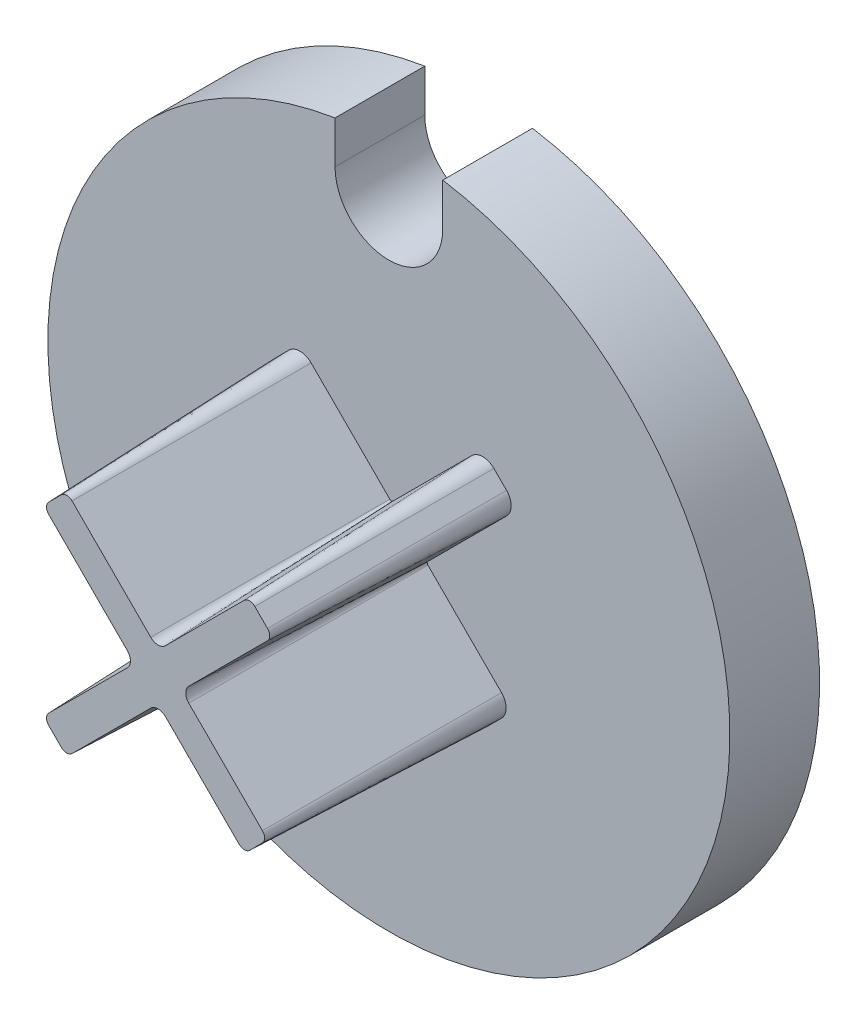
ISO-10303-21;
HEADER;
FILE_DESCRIPTION(('STEP AP214'),'2;1');
FILE_NAME('part.step','',(''),(''),'','','');
FILE_SCHEMA(('AUTOMOTIVE_DESIGN { 1 0 10303 214 1 1 1 1 }'));
ENDSEC;
DATA;
#1=APPLICATION_CONTEXT('core data for automotive mechanical design processes');
#2=APPLICATION_PROTOCOL_DEFINITION('international standard','automotive_design',2000,#1);
#3=PRODUCT_CONTEXT('',#1,'mechanical');
#4=PRODUCT('Part','Part','',(#3));
#5=PRODUCT_RELATED_PRODUCT_CATEGORY('part','',(#4));
#6=PRODUCT_DEFINITION_FORMATION('','',#4);
#7=PRODUCT_DEFINITION_CONTEXT('part definition',#1,'design');
#8=PRODUCT_DEFINITION('design','',#6,#7);
#9=PRODUCT_DEFINITION_SHAPE('','',#8);
#10=(LENGTH_UNIT() NAMED_UNIT(*) SI_UNIT(.MILLI.,.METRE.));
#11=(NAMED_UNIT(*) PLANE_ANGLE_UNIT() SI_UNIT($,.RADIAN.));
#12=(NAMED_UNIT(*) SI_UNIT($,.STERADIAN.) SOLID_ANGLE_UNIT());
#13=UNCERTAINTY_MEASURE_WITH_UNIT(LENGTH_MEASURE(1.E-05),#10,'distance_accuracy_value','');
#14=(GEOMETRIC_REPRESENTATION_CONTEXT(3) GLOBAL_UNCERTAINTY_ASSIGNED_CONTEXT((#13)) GLOBAL_UNIT_ASSIGNED_CONTEXT((#10,
#11,#12)) REPRESENTATION_CONTEXT('',''));
#15=CARTESIAN_POINT('',(0.,0.,0.));
#16=DIRECTION('',(0.,0.,1.));
#17=DIRECTION('',(1.,0.,0.));
#18=AXIS2_PLACEMENT_3D('',#15,#16,#17);
#19=CARTESIAN_POINT('',(-2.82993498988716,2.7703507497106,9.));
#20=DIRECTION('',(-0.706676030840835,0.706676030840835,0.0348994967025009));
#21=DIRECTION('',(-0.707106781186547,-0.707106781186547,0.));
#22=AXIS2_PLACEMENT_3D('',#19,#20,#21);
#23=PLANE('',#22);
#24=DIRECTION('',(0.0246776707783356,-0.0246776707783364,0.999390827019096));
#25=VECTOR('',#24,1.);
#26=CARTESIAN_POINT('',(-12324.5093436122,12324.8628970032,-499000.));
#27=LINE('',#26,#25);
#28=CARTESIAN_POINT('',(-2.78386880842862,3.13742219902068,2.50000000004093));
#29=VERTEX_POINT('',#28);
#30=CARTESIAN_POINT('',(-2.62336617450193,2.97691956509335,9.00000000003934));
#31=VERTEX_POINT('',#30);
#32=EDGE_CURVE('E204',#29,#31,#27,.T.);
#33=ORIENTED_EDGE('',*,*,#32,.F.);
#34=DIRECTION('',(-0.707106781186547,-0.707106781186547,0.));
#35=VECTOR('',#34,1.);
#36=CARTESIAN_POINT('',(-2.9904376238143,2.93085338363774,2.5));
#37=LINE('',#36,#35);
#38=CARTESIAN_POINT('',(-3.13742219902176,2.78386880842914,2.50000000004093));
#39=VERTEX_POINT('',#38);
#40=EDGE_CURVE('E199',#29,#39,#37,.T.);
#41=ORIENTED_EDGE('',*,*,#40,.T.);
#42=DIRECTION('',(0.024677670778336,-0.024677670778336,0.999390827019096));
#43=VECTOR('',#42,1.);
#44=CARTESIAN_POINT('',(-12324.862897003,12324.5093436124,-499000.));
#45=LINE('',#44,#43);
#46=CARTESIAN_POINT('',(-2.97691956509417,2.62336617450155,9.00000000003934));
#47=VERTEX_POINT('',#46);
#48=EDGE_CURVE('E201',#47,#39,#45,.F.);
#49=ORIENTED_EDGE('',*,*,#48,.F.);
#50=DIRECTION('',(-0.707106781186547,-0.707106781186547,0.));
#51=VECTOR('',#50,1.);
#52=CARTESIAN_POINT('',(-2.82993498988716,2.7703507497106,9.));
#53=LINE('',#52,#51);
#54=EDGE_CURVE('E209',#47,#31,#53,.F.);
#55=ORIENTED_EDGE('',*,*,#54,.T.);
#56=EDGE_LOOP('',(#33,#41,#49,#55));
#57=FACE_BOUND('',#56,.T.);
#58=ADVANCED_FACE('F17',(#57),#23,.T.);
#59=CARTESIAN_POINT('',(2.90064566800582,2.84106142782925,9.));
#60=DIRECTION('',(0.706676030840834,0.706676030840835,0.0348994967025009));
#61=DIRECTION('',(-0.707106781186548,0.707106781186547,0.));
#62=AXIS2_PLACEMENT_3D('',#59,#60,#61);
#63=PLANE('',#62);
#64=DIRECTION('',(-0.0246776707783364,-0.0246776707783356,0.999390827019096));
#65=VECTOR('',#64,1.);
#66=CARTESIAN_POINT('',(12325.0043183594,12324.5093436122,-499000.));
#67=LINE('',#66,#65);
#68=CARTESIAN_POINT('',(3.27884355526031,2.78386880842853,2.50000000004093));
#69=VERTEX_POINT('',#68);
#70=CARTESIAN_POINT('',(3.11834092133272,2.62336617450094,9.00000000003934));
#71=VERTEX_POINT('',#70);
#72=EDGE_CURVE('E235',#69,#71,#67,.T.);
#73=ORIENTED_EDGE('',*,*,#72,.F.);
#74=DIRECTION('',(-0.707106781186548,0.707106781186547,0.));
#75=VECTOR('',#74,1.);
#76=CARTESIAN_POINT('',(3.06114830193296,3.00156406175639,2.5));
#77=LINE('',#76,#75);
#78=CARTESIAN_POINT('',(2.92529016466504,3.13742219902203,2.50000000004093));
#79=VERTEX_POINT('',#78);
#80=EDGE_CURVE('E264',#69,#79,#77,.T.);
#81=ORIENTED_EDGE('',*,*,#80,.T.);
#82=DIRECTION('',(-0.024677670778336,-0.024677670778336,0.999390827019096));
#83=VECTOR('',#82,1.);
#84=CARTESIAN_POINT('',(12324.6507649686,12324.862897003,-499000.));
#85=LINE('',#84,#83);
#86=CARTESIAN_POINT('',(2.76478753073833,2.97691956509444,9.00000000003934));
#87=VERTEX_POINT('',#86);
#88=EDGE_CURVE('E231',#87,#79,#85,.F.);
#89=ORIENTED_EDGE('',*,*,#88,.F.);
#90=DIRECTION('',(-0.707106781186548,0.707106781186547,0.));
#91=VECTOR('',#90,1.);
#92=CARTESIAN_POINT('',(2.90064566800582,2.84106142782925,9.));
#93=LINE('',#92,#91);
#94=EDGE_CURVE('E208',#87,#71,#93,.F.);
#95=ORIENTED_EDGE('',*,*,#94,.T.);
#96=EDGE_LOOP('',(#73,#81,#89,#95));
#97=FACE_BOUND('',#96,.T.);
#98=ADVANCED_FACE('F574',(#97),#63,.T.);
#99=CARTESIAN_POINT('',(2.7703507497106,-2.82993498988716,9.));
#100=DIRECTION('',(0.706676030840835,-0.706676030840834,0.0348994967025009));
#101=DIRECTION('',(0.707106781186547,0.707106781186548,0.));
#102=AXIS2_PLACEMENT_3D('',#99,#100,#101);
#103=PLANE('',#102);
#104=DIRECTION('',(-0.024677670778336,0.024677670778336,0.999390827019096));
#105=VECTOR('',#104,1.);
#106=CARTESIAN_POINT('',(12324.5093436124,-12324.862897003,-499000.));
#107=LINE('',#106,#105);
#108=CARTESIAN_POINT('',(2.783868808427,-3.13742219902185,2.50000000004093));
#109=VERTEX_POINT('',#108);
#110=CARTESIAN_POINT('',(2.62336617449999,-2.97691956509484,9.00000000003934));
#111=VERTEX_POINT('',#110);
#112=EDGE_CURVE('E243',#109,#111,#107,.T.);
#113=ORIENTED_EDGE('',*,*,#112,.F.);
#114=DIRECTION('',(0.707106781186547,0.707106781186548,0.));
#115=VECTOR('',#114,1.);
#116=CARTESIAN_POINT('',(2.93085338363774,-2.9904376238143,2.5));
#117=LINE('',#116,#115);
#118=CARTESIAN_POINT('',(3.13742219902096,-2.78386880842745,2.50000000004093));
#119=VERTEX_POINT('',#118);
#120=EDGE_CURVE('E260',#109,#119,#117,.T.);
#121=ORIENTED_EDGE('',*,*,#120,.T.);
#122=DIRECTION('',(-0.024677670778336,0.024677670778336,0.999390827019096));
#123=VECTOR('',#122,1.);
#124=CARTESIAN_POINT('',(12324.862897003,-12324.5093436124,-499000.));
#125=LINE('',#124,#123);
#126=CARTESIAN_POINT('',(2.97691956509426,-2.62336617450013,9.00000000003934));
#127=VERTEX_POINT('',#126);
#128=EDGE_CURVE('E239',#127,#119,#125,.F.);
#129=ORIENTED_EDGE('',*,*,#128,.F.);
#130=DIRECTION('',(0.707106781186547,0.707106781186548,0.));
#131=VECTOR('',#130,1.);
#132=CARTESIAN_POINT('',(2.7703507497106,-2.82993498988716,9.));
#133=LINE('',#132,#131);
#134=EDGE_CURVE('E262',#127,#111,#133,.F.);
#135=ORIENTED_EDGE('',*,*,#134,.T.);
#136=EDGE_LOOP('',(#113,#121,#129,#135));
#137=FACE_BOUND('',#136,.T.);
#138=ADVANCED_FACE('F571',(#137),#103,.T.);
#139=CARTESIAN_POINT('',(-2.84106142782925,-2.90064566800582,9.));
#140=DIRECTION('',(-0.706676030840835,-0.706676030840835,0.0348994967025009));
#141=DIRECTION('',(0.707106781186547,-0.707106781186547,0.));
#142=AXIS2_PLACEMENT_3D('',#139,#140,#141);
#143=PLANE('',#142);
#144=DIRECTION('',(0.024677670778336,0.024677670778336,0.999390827019096));
#145=VECTOR('',#144,1.);
#146=CARTESIAN_POINT('',(-12324.862897003,-12324.6507649687,-499000.));
#147=LINE('',#146,#145);
#148=CARTESIAN_POINT('',(-3.13742219902203,-2.92529016466699,2.50000000001251));
#149=VERTEX_POINT('',#148);
#150=CARTESIAN_POINT('',(-2.97691956509502,-2.76478753073998,9.00000000001091));
#151=VERTEX_POINT('',#150);
#152=EDGE_CURVE('E252',#149,#151,#147,.T.);
#153=ORIENTED_EDGE('',*,*,#152,.F.);
#154=DIRECTION('',(0.707106781186547,-0.707106781186547,0.));
#155=VECTOR('',#154,1.);
#156=CARTESIAN_POINT('',(-3.00156406175639,-3.06114830193296,2.5));
#157=LINE('',#156,#155);
#158=CARTESIAN_POINT('',(-2.78386880842807,-3.27884355525828,2.50000000004093));
#159=VERTEX_POINT('',#158);
#160=EDGE_CURVE('E217',#149,#159,#157,.T.);
#161=ORIENTED_EDGE('',*,*,#160,.T.);
#162=DIRECTION('',(0.0246776707783352,0.0246776707783368,0.999390827019096));
#163=VECTOR('',#162,1.);
#164=CARTESIAN_POINT('',(-12324.509343612,-12325.0043183596,-499000.));
#165=LINE('',#164,#163);
#166=CARTESIAN_POINT('',(-2.62336617450106,-3.11834092133127,9.00000000003934));
#167=VERTEX_POINT('',#166);
#168=EDGE_CURVE('E248',#167,#159,#165,.F.);
#169=ORIENTED_EDGE('',*,*,#168,.F.);
#170=DIRECTION('',(0.707106781186547,-0.707106781186547,0.));
#171=VECTOR('',#170,1.);
#172=CARTESIAN_POINT('',(-2.84106142782925,-2.90064566800582,9.));
#173=LINE('',#172,#171);
#174=EDGE_CURVE('E258',#167,#151,#173,.F.);
#175=ORIENTED_EDGE('',*,*,#174,.T.);
#176=EDGE_LOOP('',(#153,#161,#169,#175));
#177=FACE_BOUND('',#176,.T.);
#178=ADVANCED_FACE('F568',(#177),#143,.T.);
#179=CARTESIAN_POINT('',(-2.82842712474619,2.47487373415291,2.50000000016826));
#180=DIRECTION('',(0.,0.,-1.));
#181=DIRECTION('',(-1.,0.,0.));
#182=AXIS2_PLACEMENT_3D('',#179,#180,#181);
#183=CONICAL_SURFACE('',#182,0.436985024740443,0.0349065850394729);
#184=ORIENTED_EDGE('',*,*,#48,.T.);
#185=CARTESIAN_POINT('',(-2.82842712474619,2.47487373415291,2.49999999999773));
#186=DIRECTION('',(0.,0.,-1.));
#187=DIRECTION('',(-1.,0.,0.));
#188=AXIS2_PLACEMENT_3D('',#185,#186,#187);
#189=CIRCLE('',#188,0.436985024746398);
#190=CARTESIAN_POINT('',(-3.13742219902268,2.16587865987643,2.49999999999886));
#191=VERTEX_POINT('',#190);
#192=EDGE_CURVE('E20',#39,#191,#189,.F.);
#193=ORIENTED_EDGE('',*,*,#192,.T.);
#194=DIRECTION('',(0.0246776707783359,0.0246776707783359,0.999390827019096));
#195=VECTOR('',#194,1.);
#196=CARTESIAN_POINT('',(-2.97691956509552,2.32638129380359,9.));
#197=LINE('',#196,#195);
#198=CARTESIAN_POINT('',(-2.97691956509534,2.32638129380377,9.00000000000728));
#199=VERTEX_POINT('',#198);
#200=EDGE_CURVE('E402',#199,#191,#197,.F.);
#201=ORIENTED_EDGE('',*,*,#200,.F.);
#202=CARTESIAN_POINT('',(-2.82842712474619,2.47487373415291,9.00000000001455));
#203=DIRECTION('',(0.,0.,-1.));
#204=DIRECTION('',(-1.,0.,0.));
#205=AXIS2_PLACEMENT_3D('',#202,#203,#204);
#206=CIRCLE('',#205,0.210000023052142);
#207=EDGE_CURVE('E216',#47,#199,#206,.F.);
#208=ORIENTED_EDGE('',*,*,#207,.F.);
#209=EDGE_LOOP('',(#184,#193,#201,#208));
#210=FACE_BOUND('',#209,.T.);
#211=ADVANCED_FACE('F213',(#210),#183,.T.);
#212=CARTESIAN_POINT('',(-2.47487373415292,2.82842712474619,2.50000000016826));
#213=DIRECTION('',(0.,0.,-1.));
#214=DIRECTION('',(-1.,0.,0.));
#215=AXIS2_PLACEMENT_3D('',#212,#213,#214);
#216=CONICAL_SURFACE('',#215,0.436985024739682,0.0349065850400188);
#217=DIRECTION('',(-0.0246776707783359,-0.024677670778336,0.999390827019096));
#218=VECTOR('',#217,1.);
#219=CARTESIAN_POINT('',(-2.3263812938036,2.97691956509552,9.));
#220=LINE('',#219,#218);
#221=CARTESIAN_POINT('',(-2.16587865987643,3.13742219902269,2.49999999999886));
#222=VERTEX_POINT('',#221);
#223=CARTESIAN_POINT('',(-2.32638129380378,2.97691956509534,9.00000000000728));
#224=VERTEX_POINT('',#223);
#225=EDGE_CURVE('E338',#222,#224,#220,.T.);
#226=ORIENTED_EDGE('',*,*,#225,.F.);
#227=CARTESIAN_POINT('',(-2.47487373415292,2.82842712474619,2.49999999999773));
#228=DIRECTION('',(0.,0.,-1.));
#229=DIRECTION('',(-1.,0.,0.));
#230=AXIS2_PLACEMENT_3D('',#227,#228,#229);
#231=CIRCLE('',#230,0.436985024745637);
#232=EDGE_CURVE('E224',#222,#29,#231,.F.);
#233=ORIENTED_EDGE('',*,*,#232,.T.);
#234=ORIENTED_EDGE('',*,*,#32,.T.);
#235=CARTESIAN_POINT('',(-2.47487373415292,2.82842712474619,9.00000000001455));
#236=DIRECTION('',(0.,0.,-1.));
#237=DIRECTION('',(-1.,0.,0.));
#238=AXIS2_PLACEMENT_3D('',#235,#236,#237);
#239=CIRCLE('',#238,0.210000023047829);
#240=EDGE_CURVE('E286',#224,#31,#239,.F.);
#241=ORIENTED_EDGE('',*,*,#240,.F.);
#242=EDGE_LOOP('',(#226,#233,#234,#241));
#243=FACE_BOUND('',#242,.T.);
#244=ADVANCED_FACE('F426',(#243),#216,.T.);
#245=CARTESIAN_POINT('',(0.0707106781186547,0.989949493661167,8.99999999984402));
#246=DIRECTION('',(0.,0.,1.));
#247=DIRECTION('',(1.,0.,0.));
#248=AXIS2_PLACEMENT_3D('',#245,#246,#247);
#249=CONICAL_SURFACE('',#248,0.289999976940283,0.0349065850400188);
#250=DIRECTION('',(0.0246776707783359,-0.024677670778336,0.999390827019096));
#251=VECTOR('',#250,1.);
#252=CARTESIAN_POINT('',(0.275771628362601,0.784888543417219,9.));
#253=LINE('',#252,#251);
#254=CARTESIAN_POINT('',(0.115268994435437,0.945391177344384,2.49999999999886));
#255=VERTEX_POINT('',#254);
#256=CARTESIAN_POINT('',(0.275771628362781,0.78488854341704,9.00000000000728));
#257=VERTEX_POINT('',#256);
#258=EDGE_CURVE('E332',#255,#257,#253,.T.);
#259=ORIENTED_EDGE('',*,*,#258,.F.);
#260=CARTESIAN_POINT('',(0.0707106781186547,0.989949493661167,2.49999999999773));
#261=DIRECTION('',(0.,0.,1.));
#262=DIRECTION('',(1.,0.,0.));
#263=AXIS2_PLACEMENT_3D('',#260,#261,#262);
#264=CIRCLE('',#263,0.0630149752484301);
#265=CARTESIAN_POINT('',(0.0261523618018717,0.945391177344385,2.49999999999886));
#266=VERTEX_POINT('',#265);
#267=EDGE_CURVE('E228',#266,#255,#264,.T.);
#268=ORIENTED_EDGE('',*,*,#267,.F.);
#269=DIRECTION('',(-0.0246776707783359,-0.024677670778336,0.999390827019096));
#270=VECTOR('',#269,1.);
#271=CARTESIAN_POINT('',(-0.134350272125292,0.784888543417221,9.));
#272=LINE('',#271,#270);
#273=CARTESIAN_POINT('',(-0.134350272125472,0.784888543417041,9.00000000000728));
#274=VERTEX_POINT('',#273);
#275=EDGE_CURVE('E396',#274,#266,#272,.F.);
#276=ORIENTED_EDGE('',*,*,#275,.F.);
#277=CARTESIAN_POINT('',(0.0707106781186547,0.989949493661167,9.00000000001455));
#278=DIRECTION('',(0.,0.,1.));
#279=DIRECTION('',(1.,0.,0.));
#280=AXIS2_PLACEMENT_3D('',#277,#278,#279);
#281=CIRCLE('',#280,0.289999976946238);
#282=EDGE_CURVE('E288',#257,#274,#281,.F.);
#283=ORIENTED_EDGE('',*,*,#282,.F.);
#284=EDGE_LOOP('',(#259,#268,#276,#283));
#285=FACE_BOUND('',#284,.T.);
#286=ADVANCED_FACE('F333',(#285),#249,.F.);
#287=CARTESIAN_POINT('',(2.61629509039023,2.82842712474619,2.50000000016826));
#288=DIRECTION('',(0.,0.,-1.));
#289=DIRECTION('',(-1.,0.,0.));
#290=AXIS2_PLACEMENT_3D('',#287,#288,#289);
#291=CONICAL_SURFACE('',#290,0.436985024742165,0.0349065850400188);
#292=ORIENTED_EDGE('',*,*,#88,.T.);
#293=CARTESIAN_POINT('',(2.61629509039023,2.82842712474619,2.49999999999773));
#294=DIRECTION('',(0.,0.,-1.));
#295=DIRECTION('',(-1.,0.,0.));
#296=AXIS2_PLACEMENT_3D('',#293,#294,#295);
#297=CIRCLE('',#296,0.43698502474812);
#298=CARTESIAN_POINT('',(2.30730001611374,3.13742219902268,2.49999999999886));
#299=VERTEX_POINT('',#298);
#300=EDGE_CURVE('E234',#79,#299,#297,.F.);
#301=ORIENTED_EDGE('',*,*,#300,.T.);
#302=DIRECTION('',(0.0246776707783359,-0.024677670778336,0.999390827019096));
#303=VECTOR('',#302,1.);
#304=CARTESIAN_POINT('',(2.4678026500409,2.97691956509552,9.));
#305=LINE('',#304,#303);
#306=CARTESIAN_POINT('',(2.46780265004108,2.97691956509534,9.00000000000728));
#307=VERTEX_POINT('',#306);
#308=EDGE_CURVE('E343',#307,#299,#305,.F.);
#309=ORIENTED_EDGE('',*,*,#308,.F.);
#310=CARTESIAN_POINT('',(2.61629509039023,2.82842712474619,9.00000000001455));
#311=DIRECTION('',(0.,0.,-1.));
#312=DIRECTION('',(-1.,0.,0.));
#313=AXIS2_PLACEMENT_3D('',#310,#311,#312);
#314=CIRCLE('',#313,0.210000023050312);
#315=EDGE_CURVE('E290',#87,#307,#314,.F.);
#316=ORIENTED_EDGE('',*,*,#315,.F.);
#317=EDGE_LOOP('',(#292,#301,#309,#316));
#318=FACE_BOUND('',#317,.T.);
#319=ADVANCED_FACE('F558',(#318),#291,.T.);
#320=CARTESIAN_POINT('',(2.9698484809835,2.47487373415292,2.50000000016826));
#321=DIRECTION('',(0.,0.,-1.));
#322=DIRECTION('',(-1.,0.,0.));
#323=AXIS2_PLACEMENT_3D('',#320,#321,#322);
#324=CONICAL_SURFACE('',#323,0.436985024741404,0.0349065850394729);
#325=DIRECTION('',(-0.0246776707783359,0.0246776707783359,0.999390827019096));
#326=VECTOR('',#325,1.);
#327=CARTESIAN_POINT('',(3.11834092133283,2.3263812938036,9.));
#328=LINE('',#327,#326);
#329=CARTESIAN_POINT('',(3.27884355526,2.16587865987643,2.49999999999886));
#330=VERTEX_POINT('',#329);
#331=CARTESIAN_POINT('',(3.11834092133265,2.32638129380378,9.00000000000728));
#332=VERTEX_POINT('',#331);
#333=EDGE_CURVE('E386',#330,#332,#328,.T.);
#334=ORIENTED_EDGE('',*,*,#333,.F.);
#335=CARTESIAN_POINT('',(2.9698484809835,2.47487373415292,2.49999999999773));
#336=DIRECTION('',(0.,0.,-1.));
#337=DIRECTION('',(-1.,0.,0.));
#338=AXIS2_PLACEMENT_3D('',#335,#336,#337);
#339=CIRCLE('',#338,0.436985024747359);
#340=EDGE_CURVE('E238',#330,#69,#339,.F.);
#341=ORIENTED_EDGE('',*,*,#340,.T.);
#342=ORIENTED_EDGE('',*,*,#72,.T.);
#343=CARTESIAN_POINT('',(2.9698484809835,2.47487373415292,9.00000000001455));
#344=DIRECTION('',(0.,0.,-1.));
#345=DIRECTION('',(-1.,0.,0.));
#346=AXIS2_PLACEMENT_3D('',#343,#344,#345);
#347=CIRCLE('',#346,0.210000023053104);
#348=EDGE_CURVE('E292',#332,#71,#347,.F.);
#349=ORIENTED_EDGE('',*,*,#348,.F.);
#350=EDGE_LOOP('',(#334,#341,#342,#349));
#351=FACE_BOUND('',#350,.T.);
#352=ADVANCED_FACE('F492',(#351),#324,.T.);
#353=CARTESIAN_POINT('',(2.82842712474619,-2.47487373415291,2.50000000016826));
#354=DIRECTION('',(0.,0.,-1.));
#355=DIRECTION('',(-1.,0.,0.));
#356=AXIS2_PLACEMENT_3D('',#353,#354,#355);
#357=CONICAL_SURFACE('',#356,0.436985024738868,0.0349065850400188);
#358=ORIENTED_EDGE('',*,*,#128,.T.);
#359=CARTESIAN_POINT('',(2.82842712474619,-2.47487373415291,2.49999999999773));
#360=DIRECTION('',(0.,0.,-1.));
#361=DIRECTION('',(-1.,0.,0.));
#362=AXIS2_PLACEMENT_3D('',#359,#360,#361);
#363=CIRCLE('',#362,0.436985024744824);
#364=CARTESIAN_POINT('',(3.13742219902268,-2.16587865987643,2.49999999999886));
#365=VERTEX_POINT('',#364);
#366=EDGE_CURVE('E242',#119,#365,#363,.F.);
#367=ORIENTED_EDGE('',*,*,#366,.T.);
#368=DIRECTION('',(-0.0246776707783359,-0.0246776707783359,0.999390827019096));
#369=VECTOR('',#368,1.);
#370=CARTESIAN_POINT('',(2.97691956509552,-2.32638129380359,9.));
#371=LINE('',#370,#369);
#372=CARTESIAN_POINT('',(2.97691956509534,-2.32638129380377,9.00000000000728));
#373=VERTEX_POINT('',#372);
#374=EDGE_CURVE('E382',#373,#365,#371,.F.);
#375=ORIENTED_EDGE('',*,*,#374,.F.);
#376=CARTESIAN_POINT('',(2.82842712474619,-2.47487373415291,9.00000000001455));
#377=DIRECTION('',(0.,0.,-1.));
#378=DIRECTION('',(-1.,0.,0.));
#379=AXIS2_PLACEMENT_3D('',#376,#377,#378);
#380=CIRCLE('',#379,0.210000023047015);
#381=EDGE_CURVE('E297',#127,#373,#380,.F.);
#382=ORIENTED_EDGE('',*,*,#381,.F.);
#383=EDGE_LOOP('',(#358,#367,#375,#382));
#384=FACE_BOUND('',#383,.T.);
#385=ADVANCED_FACE('F552',(#384),#357,.T.);
#386=CARTESIAN_POINT('',(1.13137084989848,-0.0707106781186537,8.99999999984402));
#387=DIRECTION('',(0.,0.,1.));
#388=DIRECTION('',(1.,0.,0.));
#389=AXIS2_PLACEMENT_3D('',#386,#387,#388);
#390=CONICAL_SURFACE('',#389,0.289999976941538,0.0349065850400188);
#391=DIRECTION('',(-0.0246776707783359,-0.0246776707783359,0.999390827019096));
#392=VECTOR('',#391,1.);
#393=CARTESIAN_POINT('',(0.926309899654531,-0.275771628362602,9.));
#394=LINE('',#393,#392);
#395=CARTESIAN_POINT('',(1.0868125335817,-0.115268994435438,2.49999999999886));
#396=VERTEX_POINT('',#395);
#397=CARTESIAN_POINT('',(0.926309899654352,-0.275771628362782,9.00000000000728));
#398=VERTEX_POINT('',#397);
#399=EDGE_CURVE('E376',#396,#398,#394,.T.);
#400=ORIENTED_EDGE('',*,*,#399,.F.);
#401=CARTESIAN_POINT('',(1.13137084989848,-0.0707106781186537,2.49999999999773));
#402=DIRECTION('',(0.,0.,1.));
#403=DIRECTION('',(1.,0.,0.));
#404=AXIS2_PLACEMENT_3D('',#401,#402,#403);
#405=CIRCLE('',#404,0.0630149752496852);
#406=CARTESIAN_POINT('',(1.08681253358169,-0.0261523618018718,2.49999999999886));
#407=VERTEX_POINT('',#406);
#408=EDGE_CURVE('E247',#407,#396,#405,.T.);
#409=ORIENTED_EDGE('',*,*,#408,.F.);
#410=DIRECTION('',(-0.0246776707783359,0.0246776707783359,0.999390827019096));
#411=VECTOR('',#410,1.);
#412=CARTESIAN_POINT('',(0.92630989965453,0.134350272125293,9.));
#413=LINE('',#412,#411);
#414=CARTESIAN_POINT('',(0.92630989965435,0.134350272125473,9.00000000000728));
#415=VERTEX_POINT('',#414);
#416=EDGE_CURVE('E389',#415,#407,#413,.F.);
#417=ORIENTED_EDGE('',*,*,#416,.F.);
#418=CARTESIAN_POINT('',(1.13137084989848,-0.0707106781186537,9.00000000001455));
#419=DIRECTION('',(0.,0.,1.));
#420=DIRECTION('',(1.,0.,0.));
#421=AXIS2_PLACEMENT_3D('',#418,#419,#420);
#422=CIRCLE('',#421,0.289999976947493);
#423=EDGE_CURVE('E295',#398,#415,#422,.F.);
#424=ORIENTED_EDGE('',*,*,#423,.F.);
#425=EDGE_LOOP('',(#400,#409,#417,#424));
#426=FACE_BOUND('',#425,.T.);
#427=ADVANCED_FACE('F496',(#426),#390,.F.);
#428=CARTESIAN_POINT('',(2.47487373415291,-2.82842712474619,2.50000000016826));
#429=DIRECTION('',(0.,0.,-1.));
#430=DIRECTION('',(-1.,0.,0.));
#431=AXIS2_PLACEMENT_3D('',#428,#429,#430);
#432=CONICAL_SURFACE('',#431,0.436985024739639,0.0349065850400188);
#433=DIRECTION('',(0.0246776707783359,0.0246776707783359,0.999390827019096));
#434=VECTOR('',#433,1.);
#435=CARTESIAN_POINT('',(2.3263812938036,-2.97691956509552,9.));
#436=LINE('',#435,#434);
#437=CARTESIAN_POINT('',(2.16587865987643,-3.13742219902269,2.49999999999886));
#438=VERTEX_POINT('',#437);
#439=CARTESIAN_POINT('',(2.32638129380378,-2.97691956509534,9.00000000000728));
#440=VERTEX_POINT('',#439);
#441=EDGE_CURVE('E373',#438,#440,#436,.T.);
#442=ORIENTED_EDGE('',*,*,#441,.F.);
#443=CARTESIAN_POINT('',(2.47487373415291,-2.82842712474619,2.49999999999773));
#444=DIRECTION('',(0.,0.,-1.));
#445=DIRECTION('',(-1.,0.,0.));
#446=AXIS2_PLACEMENT_3D('',#443,#444,#445);
#447=CIRCLE('',#446,0.436985024745594);
#448=EDGE_CURVE('E246',#438,#109,#447,.F.);
#449=ORIENTED_EDGE('',*,*,#448,.T.);
#450=ORIENTED_EDGE('',*,*,#112,.T.);
#451=CARTESIAN_POINT('',(2.47487373415291,-2.82842712474619,9.00000000001455));
#452=DIRECTION('',(0.,0.,-1.));
#453=DIRECTION('',(-1.,0.,0.));
#454=AXIS2_PLACEMENT_3D('',#451,#452,#453);
#455=CIRCLE('',#454,0.210000023047786);
#456=EDGE_CURVE('E299',#440,#111,#455,.F.);
#457=ORIENTED_EDGE('',*,*,#456,.F.);
#458=EDGE_LOOP('',(#442,#449,#450,#457));
#459=FACE_BOUND('',#458,.T.);
#460=ADVANCED_FACE('F545',(#459),#432,.T.);
#461=CARTESIAN_POINT('',(-2.47487373415292,-2.9698484809835,2.50000000016826));
#462=DIRECTION('',(0.,0.,-1.));
#463=DIRECTION('',(-1.,0.,0.));
#464=AXIS2_PLACEMENT_3D('',#461,#462,#463);
#465=CONICAL_SURFACE('',#464,0.436985024739682,0.0349065850400188);
#466=ORIENTED_EDGE('',*,*,#168,.T.);
#467=CARTESIAN_POINT('',(-2.47487373415292,-2.9698484809835,2.49999999999773));
#468=DIRECTION('',(0.,0.,-1.));
#469=DIRECTION('',(-1.,0.,0.));
#470=AXIS2_PLACEMENT_3D('',#467,#468,#469);
#471=CIRCLE('',#470,0.436985024745637);
#472=CARTESIAN_POINT('',(-2.16587865987642,-3.27884355525999,2.49999999999886));
#473=VERTEX_POINT('',#472);
#474=EDGE_CURVE('E251',#159,#473,#471,.F.);
#475=ORIENTED_EDGE('',*,*,#474,.T.);
#476=DIRECTION('',(-0.0246776707783359,0.0246776707783359,0.999390827019096));
#477=VECTOR('',#476,1.);
#478=CARTESIAN_POINT('',(-2.32638129380359,-3.11834092133282,9.));
#479=LINE('',#478,#477);
#480=CARTESIAN_POINT('',(-2.32638129380377,-3.11834092133264,9.00000000000728));
#481=VERTEX_POINT('',#480);
#482=EDGE_CURVE('E369',#481,#473,#479,.F.);
#483=ORIENTED_EDGE('',*,*,#482,.F.);
#484=CARTESIAN_POINT('',(-2.47487373415292,-2.9698484809835,9.00000000001455));
#485=DIRECTION('',(0.,0.,-1.));
#486=DIRECTION('',(-1.,0.,0.));
#487=AXIS2_PLACEMENT_3D('',#484,#485,#486);
#488=CIRCLE('',#487,0.210000023047829);
#489=EDGE_CURVE('E304',#167,#481,#488,.F.);
#490=ORIENTED_EDGE('',*,*,#489,.F.);
#491=EDGE_LOOP('',(#466,#475,#483,#490));
#492=FACE_BOUND('',#491,.T.);
#493=ADVANCED_FACE('F541',(#492),#465,.T.);
#494=CARTESIAN_POINT('',(0.0707106781186551,-1.13137084989848,8.99999999984402));
#495=DIRECTION('',(0.,0.,1.));
#496=DIRECTION('',(1.,0.,0.));
#497=AXIS2_PLACEMENT_3D('',#494,#495,#496);
#498=CONICAL_SURFACE('',#497,0.289999976940283,0.0349065850400188);
#499=DIRECTION('',(-0.0246776707783359,0.0246776707783359,0.999390827019096));
#500=VECTOR('',#499,1.);
#501=CARTESIAN_POINT('',(-0.134350272125289,-0.926309899654526,9.));
#502=LINE('',#501,#500);
#503=CARTESIAN_POINT('',(0.0261523618018742,-1.08681253358169,2.49999999999886));
#504=VERTEX_POINT('',#503);
#505=CARTESIAN_POINT('',(-0.134350272125469,-0.926309899654347,9.00000000000728));
#506=VERTEX_POINT('',#505);
#507=EDGE_CURVE('E364',#504,#506,#502,.T.);
#508=ORIENTED_EDGE('',*,*,#507,.F.);
#509=CARTESIAN_POINT('',(0.0707106781186551,-1.13137084989848,2.49999999999773));
#510=DIRECTION('',(0.,0.,1.));
#511=DIRECTION('',(1.,0.,0.));
#512=AXIS2_PLACEMENT_3D('',#509,#510,#511);
#513=CIRCLE('',#512,0.0630149752484297);
#514=CARTESIAN_POINT('',(0.115268994435438,-1.08681253358169,2.49999999999886));
#515=VERTEX_POINT('',#514);
#516=EDGE_CURVE('E256',#515,#504,#513,.T.);
#517=ORIENTED_EDGE('',*,*,#516,.F.);
#518=DIRECTION('',(0.0246776707783359,0.0246776707783359,0.999390827019096));
#519=VECTOR('',#518,1.);
#520=CARTESIAN_POINT('',(0.275771628362601,-0.926309899654528,9.));
#521=LINE('',#520,#519);
#522=CARTESIAN_POINT('',(0.275771628362781,-0.926309899654349,9.00000000000728));
#523=VERTEX_POINT('',#522);
#524=EDGE_CURVE('E377',#523,#515,#521,.F.);
#525=ORIENTED_EDGE('',*,*,#524,.F.);
#526=CARTESIAN_POINT('',(0.0707106781186551,-1.13137084989848,9.00000000001455));
#527=DIRECTION('',(0.,0.,1.));
#528=DIRECTION('',(1.,0.,0.));
#529=AXIS2_PLACEMENT_3D('',#526,#527,#528);
#530=CIRCLE('',#529,0.289999976946238);
#531=EDGE_CURVE('E302',#506,#523,#530,.F.);
#532=ORIENTED_EDGE('',*,*,#531,.F.);
#533=EDGE_LOOP('',(#508,#517,#525,#532));
#534=FACE_BOUND('',#533,.T.);
#535=ADVANCED_FACE('F537',(#534),#498,.F.);
#536=CARTESIAN_POINT('',(-2.8284271247462,-2.61629509039023,2.50000000016826));
#537=DIRECTION('',(0.,0.,-1.));
#538=DIRECTION('',(-1.,0.,0.));
#539=AXIS2_PLACEMENT_3D('',#536,#537,#538);
#540=CONICAL_SURFACE('',#539,0.436985024740453,0.0349065850394729);
#541=DIRECTION('',(0.0246776707783359,-0.024677670778336,0.999390827019096));
#542=VECTOR('',#541,1.);
#543=CARTESIAN_POINT('',(-2.97691956509552,-2.4678026500409,9.));
#544=LINE('',#543,#542);
#545=CARTESIAN_POINT('',(-3.13742219902269,-2.30730001611373,2.49999999999886));
#546=VERTEX_POINT('',#545);
#547=CARTESIAN_POINT('',(-2.97691956509534,-2.46780265004108,9.00000000000728));
#548=VERTEX_POINT('',#547);
#549=EDGE_CURVE('E361',#546,#548,#544,.T.);
#550=ORIENTED_EDGE('',*,*,#549,.F.);
#551=CARTESIAN_POINT('',(-2.8284271247462,-2.61629509039023,2.49999999999773));
#552=DIRECTION('',(0.,0.,-1.));
#553=DIRECTION('',(-1.,0.,0.));
#554=AXIS2_PLACEMENT_3D('',#551,#552,#553);
#555=CIRCLE('',#554,0.436985024746408);
#556=EDGE_CURVE('E255',#546,#149,#555,.F.);
#557=ORIENTED_EDGE('',*,*,#556,.T.);
#558=ORIENTED_EDGE('',*,*,#152,.T.);
#559=CARTESIAN_POINT('',(-2.8284271247462,-2.61629509039023,9.00000000001455));
#560=DIRECTION('',(0.,0.,-1.));
#561=DIRECTION('',(-1.,0.,0.));
#562=AXIS2_PLACEMENT_3D('',#559,#560,#561);
#563=CIRCLE('',#562,0.210000023052152);
#564=EDGE_CURVE('E306',#548,#151,#563,.F.);
#565=ORIENTED_EDGE('',*,*,#564,.F.);
#566=EDGE_LOOP('',(#550,#557,#558,#565));
#567=FACE_BOUND('',#566,.T.);
#568=ADVANCED_FACE('F532',(#567),#540,.T.);
#569=CARTESIAN_POINT('',(0.,-0.059584240176571,9.));
#570=DIRECTION('',(0.,0.,1.));
#571=DIRECTION('',(1.,0.,0.));
#572=AXIS2_PLACEMENT_3D('',#569,#570,#571);
#573=PLANE('',#572);
#574=ORIENTED_EDGE('',*,*,#54,.F.);
#575=ORIENTED_EDGE('',*,*,#207,.T.);
#576=DIRECTION('',(0.707106781186547,-0.707106781186547,0.));
#577=VECTOR('',#576,1.);
#578=CARTESIAN_POINT('',(-0.295477015557679,-0.35506125573425,9.));
#579=LINE('',#578,#577);
#580=CARTESIAN_POINT('',(-0.784888543417041,0.134350272125472,9.00000000000728));
#581=VERTEX_POINT('',#580);
#582=EDGE_CURVE('E401',#581,#199,#579,.F.);
#583=ORIENTED_EDGE('',*,*,#582,.F.);
#584=CARTESIAN_POINT('',(-0.989949493661167,-0.0707106781186541,9.00000000001455));
#585=DIRECTION('',(0.,0.,1.));
#586=DIRECTION('',(1.,0.,0.));
#587=AXIS2_PLACEMENT_3D('',#584,#585,#586);
#588=CIRCLE('',#587,0.289999976948532);
#589=CARTESIAN_POINT('',(-0.784888543417041,-0.27577162836278,9.00000000000728));
#590=VERTEX_POINT('',#589);
#591=EDGE_CURVE('E279',#581,#590,#588,.F.);
#592=ORIENTED_EDGE('',*,*,#591,.T.);
#593=DIRECTION('',(-0.707106781186548,-0.707106781186547,0.));
#594=VECTOR('',#593,1.);
#595=CARTESIAN_POINT('',(-0.284350577615595,0.224766337439024,9.));
#596=LINE('',#595,#594);
#597=EDGE_CURVE('E363',#548,#590,#596,.F.);
#598=ORIENTED_EDGE('',*,*,#597,.F.);
#599=ORIENTED_EDGE('',*,*,#564,.T.);
#600=ORIENTED_EDGE('',*,*,#174,.F.);
#601=ORIENTED_EDGE('',*,*,#489,.T.);
#602=DIRECTION('',(0.707106781186547,0.707106781186547,0.));
#603=VECTOR('',#602,1.);
#604=CARTESIAN_POINT('',(0.366187693676333,-0.425771933852904,9.));
#605=LINE('',#604,#603);
#606=EDGE_CURVE('E372',#506,#481,#605,.F.);
#607=ORIENTED_EDGE('',*,*,#606,.F.);
#608=ORIENTED_EDGE('',*,*,#531,.T.);
#609=DIRECTION('',(0.707106781186547,-0.707106781186547,0.));
#610=VECTOR('',#609,1.);
#611=CARTESIAN_POINT('',(-0.295477015557678,-0.355061255734249,9.));
#612=LINE('',#611,#610);
#613=EDGE_CURVE('E375',#440,#523,#612,.F.);
#614=ORIENTED_EDGE('',*,*,#613,.F.);
#615=ORIENTED_EDGE('',*,*,#456,.T.);
#616=ORIENTED_EDGE('',*,*,#134,.F.);
#617=ORIENTED_EDGE('',*,*,#381,.T.);
#618=DIRECTION('',(-0.707106781186547,0.707106781186547,0.));
#619=VECTOR('',#618,1.);
#620=CARTESIAN_POINT('',(0.35506125573425,0.295477015557679,9.));
#621=LINE('',#620,#619);
#622=EDGE_CURVE('E385',#398,#373,#621,.F.);
#623=ORIENTED_EDGE('',*,*,#622,.F.);
#624=ORIENTED_EDGE('',*,*,#423,.T.);
#625=DIRECTION('',(0.707106781186547,0.707106781186547,0.));
#626=VECTOR('',#625,1.);
#627=CARTESIAN_POINT('',(0.366187693676333,-0.425771933852904,9.));
#628=LINE('',#627,#626);
#629=EDGE_CURVE('E391',#332,#415,#628,.F.);
#630=ORIENTED_EDGE('',*,*,#629,.F.);
#631=ORIENTED_EDGE('',*,*,#348,.T.);
#632=ORIENTED_EDGE('',*,*,#94,.F.);
#633=ORIENTED_EDGE('',*,*,#315,.T.);
#634=DIRECTION('',(-0.707106781186548,-0.707106781186547,0.));
#635=VECTOR('',#634,1.);
#636=CARTESIAN_POINT('',(-0.284350577615595,0.224766337439024,9.));
#637=LINE('',#636,#635);
#638=EDGE_CURVE('E337',#257,#307,#637,.F.);
#639=ORIENTED_EDGE('',*,*,#638,.F.);
#640=ORIENTED_EDGE('',*,*,#282,.T.);
#641=DIRECTION('',(-0.707106781186548,0.707106781186547,0.));
#642=VECTOR('',#641,1.);
#643=CARTESIAN_POINT('',(0.35506125573425,0.295477015557679,9.));
#644=LINE('',#643,#642);
#645=EDGE_CURVE('E398',#224,#274,#644,.F.);
#646=ORIENTED_EDGE('',*,*,#645,.F.);
#647=ORIENTED_EDGE('',*,*,#240,.T.);
#648=EDGE_LOOP('',(#574,#575,#583,#592,#598,#599,#600,#601,#607,#608,#614,#615,#616,#617,#623,
#624,#630,#631,#632,#633,#639,#640,#646,#647));
#649=FACE_BOUND('',#648,.T.);
#650=ADVANCED_FACE('F421',(#649),#573,.T.);
#651=CARTESIAN_POINT('',(-0.989949493661167,-0.0707106781186541,8.99999999984402));
#652=DIRECTION('',(0.,0.,1.));
#653=DIRECTION('',(1.,0.,0.));
#654=AXIS2_PLACEMENT_3D('',#651,#652,#653);
#655=CONICAL_SURFACE('',#654,0.289999976942577,0.0349065850400188);
#656=DIRECTION('',(0.0246776707783359,0.0246776707783359,0.999390827019096));
#657=VECTOR('',#656,1.);
#658=CARTESIAN_POINT('',(-0.784888543417221,0.134350272125292,9.));
#659=LINE('',#658,#657);
#660=CARTESIAN_POINT('',(-0.945391177344385,-0.0261523618018719,2.49999999999886));
#661=VERTEX_POINT('',#660);
#662=EDGE_CURVE('E282',#661,#581,#659,.T.);
#663=ORIENTED_EDGE('',*,*,#662,.F.);
#664=CARTESIAN_POINT('',(-0.989949493661167,-0.0707106781186541,2.49999999999773));
#665=DIRECTION('',(0.,0.,1.));
#666=DIRECTION('',(1.,0.,0.));
#667=AXIS2_PLACEMENT_3D('',#664,#665,#666);
#668=CIRCLE('',#667,0.0630149752507241);
#669=CARTESIAN_POINT('',(-0.945391177344384,-0.115268994435437,2.49999999999886));
#670=VERTEX_POINT('',#669);
#671=EDGE_CURVE('E283',#670,#661,#668,.T.);
#672=ORIENTED_EDGE('',*,*,#671,.F.);
#673=DIRECTION('',(0.0246776707783359,-0.024677670778336,0.999390827019096));
#674=VECTOR('',#673,1.);
#675=CARTESIAN_POINT('',(-0.78488854341722,-0.275771628362601,9.));
#676=LINE('',#675,#674);
#677=EDGE_CURVE('E360',#590,#670,#676,.F.);
#678=ORIENTED_EDGE('',*,*,#677,.F.);
#679=ORIENTED_EDGE('',*,*,#591,.F.);
#680=EDGE_LOOP('',(#663,#672,#678,#679));
#681=FACE_BOUND('',#680,.T.);
#682=ADVANCED_FACE('F438',(#681),#655,.F.);
#683=CARTESIAN_POINT('',(-0.295477015557679,-0.35506125573425,9.));
#684=DIRECTION('',(-0.706676030840835,-0.706676030840835,0.0348994967025009));
#685=DIRECTION('',(0.707106781186547,-0.707106781186547,0.));
#686=AXIS2_PLACEMENT_3D('',#683,#684,#685);
#687=PLANE('',#686);
#688=ORIENTED_EDGE('',*,*,#200,.T.);
#689=DIRECTION('',(-0.707106781186547,0.707106781186548,0.));
#690=VECTOR('',#689,1.);
#691=CARTESIAN_POINT('',(-0.945391177344357,-0.0261523618018438,2.5));
#692=LINE('',#691,#690);
#693=EDGE_CURVE('E223',#661,#191,#692,.T.);
#694=ORIENTED_EDGE('',*,*,#693,.F.);
#695=ORIENTED_EDGE('',*,*,#662,.T.);
#696=ORIENTED_EDGE('',*,*,#582,.T.);
#697=EDGE_LOOP('',(#688,#694,#695,#696));
#698=FACE_BOUND('',#697,.T.);
#699=ADVANCED_FACE('F418',(#698),#687,.T.);
#700=CARTESIAN_POINT('',(0.35506125573425,0.295477015557679,9.));
#701=DIRECTION('',(0.706676030840834,0.706676030840835,0.0348994967025009));
#702=DIRECTION('',(-0.707106781186548,0.707106781186547,0.));
#703=AXIS2_PLACEMENT_3D('',#700,#701,#702);
#704=PLANE('',#703);
#705=DIRECTION('',(0.707106781186548,-0.707106781186547,0.));
#706=VECTOR('',#705,1.);
#707=CARTESIAN_POINT('',(-2.16587865987646,3.13742219902266,2.5));
#708=LINE('',#707,#706);
#709=EDGE_CURVE('E327',#222,#266,#708,.T.);
#710=ORIENTED_EDGE('',*,*,#709,.F.);
#711=ORIENTED_EDGE('',*,*,#225,.T.);
#712=ORIENTED_EDGE('',*,*,#645,.T.);
#713=ORIENTED_EDGE('',*,*,#275,.T.);
#714=EDGE_LOOP('',(#710,#711,#712,#713));
#715=FACE_BOUND('',#714,.T.);
#716=ADVANCED_FACE('F428',(#715),#704,.T.);
#717=CARTESIAN_POINT('',(-0.284350577615595,0.224766337439024,9.));
#718=DIRECTION('',(-0.706676030840834,0.706676030840835,0.0348994967025009));
#719=DIRECTION('',(-0.707106781186548,-0.707106781186547,0.));
#720=AXIS2_PLACEMENT_3D('',#717,#718,#719);
#721=PLANE('',#720);
#722=ORIENTED_EDGE('',*,*,#308,.T.);
#723=DIRECTION('',(0.707106781186546,0.707106781186549,0.));
#724=VECTOR('',#723,1.);
#725=CARTESIAN_POINT('',(0.115268994435465,0.945391177344356,2.5));
#726=LINE('',#725,#724);
#727=EDGE_CURVE('E325',#255,#299,#726,.T.);
#728=ORIENTED_EDGE('',*,*,#727,.F.);
#729=ORIENTED_EDGE('',*,*,#258,.T.);
#730=ORIENTED_EDGE('',*,*,#638,.T.);
#731=EDGE_LOOP('',(#722,#728,#729,#730));
#732=FACE_BOUND('',#731,.T.);
#733=ADVANCED_FACE('F341',(#732),#721,.T.);
#734=CARTESIAN_POINT('',(0.366187693676333,-0.425771933852904,9.));
#735=DIRECTION('',(0.706676030840835,-0.706676030840835,0.0348994967025009));
#736=DIRECTION('',(0.707106781186547,0.707106781186547,0.));
#737=AXIS2_PLACEMENT_3D('',#734,#735,#736);
#738=PLANE('',#737);
#739=DIRECTION('',(-0.707106781186547,-0.707106781186548,0.));
#740=VECTOR('',#739,1.);
#741=CARTESIAN_POINT('',(3.27884355525997,2.16587865987646,2.5));
#742=LINE('',#741,#740);
#743=EDGE_CURVE('E344',#330,#407,#742,.T.);
#744=ORIENTED_EDGE('',*,*,#743,.F.);
#745=ORIENTED_EDGE('',*,*,#333,.T.);
#746=ORIENTED_EDGE('',*,*,#629,.T.);
#747=ORIENTED_EDGE('',*,*,#416,.T.);
#748=EDGE_LOOP('',(#744,#745,#746,#747));
#749=FACE_BOUND('',#748,.T.);
#750=ADVANCED_FACE('F436',(#749),#738,.T.);
#751=CARTESIAN_POINT('',(0.35506125573425,0.295477015557679,9.));
#752=DIRECTION('',(0.706676030840835,0.706676030840835,0.0348994967025009));
#753=DIRECTION('',(-0.707106781186547,0.707106781186547,0.));
#754=AXIS2_PLACEMENT_3D('',#751,#752,#753);
#755=PLANE('',#754);
#756=DIRECTION('',(0.707106781186547,-0.707106781186549,0.));
#757=VECTOR('',#756,1.);
#758=CARTESIAN_POINT('',(1.08681253358167,-0.115268994435464,2.5));
#759=LINE('',#758,#757);
#760=EDGE_CURVE('E347',#396,#365,#759,.T.);
#761=ORIENTED_EDGE('',*,*,#760,.F.);
#762=ORIENTED_EDGE('',*,*,#399,.T.);
#763=ORIENTED_EDGE('',*,*,#622,.T.);
#764=ORIENTED_EDGE('',*,*,#374,.T.);
#765=EDGE_LOOP('',(#761,#762,#763,#764));
#766=FACE_BOUND('',#765,.T.);
#767=ADVANCED_FACE('F475',(#766),#755,.T.);
#768=CARTESIAN_POINT('',(-0.295477015557678,-0.355061255734249,9.));
#769=DIRECTION('',(-0.706676030840835,-0.706676030840835,0.0348994967025009));
#770=DIRECTION('',(0.707106781186547,-0.707106781186547,0.));
#771=AXIS2_PLACEMENT_3D('',#768,#769,#770);
#772=PLANE('',#771);
#773=ORIENTED_EDGE('',*,*,#524,.T.);
#774=DIRECTION('',(-0.707106781186547,0.707106781186548,0.));
#775=VECTOR('',#774,1.);
#776=CARTESIAN_POINT('',(2.16587865987646,-3.13742219902266,2.5));
#777=LINE('',#776,#775);
#778=EDGE_CURVE('E500',#438,#515,#777,.T.);
#779=ORIENTED_EDGE('',*,*,#778,.F.);
#780=ORIENTED_EDGE('',*,*,#441,.T.);
#781=ORIENTED_EDGE('',*,*,#613,.T.);
#782=EDGE_LOOP('',(#773,#779,#780,#781));
#783=FACE_BOUND('',#782,.T.);
#784=ADVANCED_FACE('F471',(#783),#772,.T.);
#785=CARTESIAN_POINT('',(0.366187693676333,-0.425771933852904,9.));
#786=DIRECTION('',(0.706676030840835,-0.706676030840835,0.0348994967025009));
#787=DIRECTION('',(0.707106781186547,0.707106781186547,0.));
#788=AXIS2_PLACEMENT_3D('',#785,#786,#787);
#789=PLANE('',#788);
#790=DIRECTION('',(-0.707106781186547,-0.707106781186548,0.));
#791=VECTOR('',#790,1.);
#792=CARTESIAN_POINT('',(0.0261523618018443,-1.08681253358166,2.5));
#793=LINE('',#792,#791);
#794=EDGE_CURVE('E502',#504,#473,#793,.T.);
#795=ORIENTED_EDGE('',*,*,#794,.F.);
#796=ORIENTED_EDGE('',*,*,#507,.T.);
#797=ORIENTED_EDGE('',*,*,#606,.T.);
#798=ORIENTED_EDGE('',*,*,#482,.T.);
#799=EDGE_LOOP('',(#795,#796,#797,#798));
#800=FACE_BOUND('',#799,.T.);
#801=ADVANCED_FACE('F467',(#800),#789,.T.);
#802=CARTESIAN_POINT('',(-0.284350577615595,0.224766337439024,9.));
#803=DIRECTION('',(-0.706676030840834,0.706676030840835,0.0348994967025009));
#804=DIRECTION('',(-0.707106781186548,-0.707106781186547,0.));
#805=AXIS2_PLACEMENT_3D('',#802,#803,#804);
#806=PLANE('',#805);
#807=ORIENTED_EDGE('',*,*,#677,.T.);
#808=DIRECTION('',(0.707106781186549,0.707106781186546,0.));
#809=VECTOR('',#808,1.);
#810=CARTESIAN_POINT('',(-3.13742219902266,-2.30730001611376,2.5));
#811=LINE('',#810,#809);
#812=EDGE_CURVE('E278',#546,#670,#811,.T.);
#813=ORIENTED_EDGE('',*,*,#812,.F.);
#814=ORIENTED_EDGE('',*,*,#549,.T.);
#815=ORIENTED_EDGE('',*,*,#597,.T.);
#816=EDGE_LOOP('',(#807,#813,#814,#815));
#817=FACE_BOUND('',#816,.T.);
#818=ADVANCED_FACE('F463',(#817),#806,.T.);
#819=CARTESIAN_POINT('',(-1.5,8.79041575982343,27.2542654516506));
#820=DIRECTION('',(1.,0.,0.));
#821=DIRECTION('',(0.,1.,0.));
#822=AXIS2_PLACEMENT_3D('',#819,#820,#821);
#823=PLANE('',#822);
#824=DIRECTION('',(0.,0.,-1.));
#825=VECTOR('',#824,1.);
#826=CARTESIAN_POINT('',(-1.5,9.38083151964686,2.5));
#827=LINE('',#826,#825);
#828=CARTESIAN_POINT('',(-1.5,9.38083151964686,2.5));
#829=VERTEX_POINT('',#828);
#830=CARTESIAN_POINT('',(-1.5,9.38083151964686,0.));
#831=VERTEX_POINT('',#830);
#832=EDGE_CURVE('E277',#829,#831,#827,.T.);
#833=ORIENTED_EDGE('',*,*,#832,.F.);
#834=DIRECTION('',(0.,1.,0.));
#835=VECTOR('',#834,1.);
#836=CARTESIAN_POINT('',(-1.5,0.,2.5));
#837=LINE('',#836,#835);
#838=CARTESIAN_POINT('',(-1.5,8.2,2.5));
#839=VERTEX_POINT('',#838);
#840=EDGE_CURVE('E353',#839,#829,#837,.T.);
#841=ORIENTED_EDGE('',*,*,#840,.F.);
#842=DIRECTION('',(0.,0.,-1.));
#843=VECTOR('',#842,1.);
#844=CARTESIAN_POINT('',(-1.5,8.2,27.2542654516506));
#845=LINE('',#844,#843);
#846=CARTESIAN_POINT('',(-1.5,8.2,0.));
#847=VERTEX_POINT('',#846);
#848=EDGE_CURVE('E512',#839,#847,#845,.T.);
#849=ORIENTED_EDGE('',*,*,#848,.T.);
#850=DIRECTION('',(0.,1.,0.));
#851=VECTOR('',#850,1.);
#852=CARTESIAN_POINT('',(-1.5,8.79041575982343,0.));
#853=LINE('',#852,#851);
#854=EDGE_CURVE('E358',#847,#831,#853,.T.);
#855=ORIENTED_EDGE('',*,*,#854,.T.);
#856=EDGE_LOOP('',(#833,#841,#849,#855));
#857=FACE_BOUND('',#856,.T.);
#858=ADVANCED_FACE('F460',(#857),#823,.T.);
#859=CARTESIAN_POINT('',(1.5,8.79041575982343,27.2542654516506));
#860=DIRECTION('',(-1.,0.,0.));
#861=DIRECTION('',(0.,-1.,0.));
#862=AXIS2_PLACEMENT_3D('',#859,#860,#861);
#863=PLANE('',#862);
#864=DIRECTION('',(0.,0.,-1.));
#865=VECTOR('',#864,1.);
#866=CARTESIAN_POINT('',(1.5,8.2,27.2542654516506));
#867=LINE('',#866,#865);
#868=CARTESIAN_POINT('',(1.5,8.2,0.));
#869=VERTEX_POINT('',#868);
#870=CARTESIAN_POINT('',(1.5,8.2,2.5));
#871=VERTEX_POINT('',#870);
#872=EDGE_CURVE('E273',#869,#871,#867,.F.);
#873=ORIENTED_EDGE('',*,*,#872,.T.);
#874=DIRECTION('',(0.,1.,0.));
#875=VECTOR('',#874,1.);
#876=CARTESIAN_POINT('',(1.5,0.,2.5));
#877=LINE('',#876,#875);
#878=CARTESIAN_POINT('',(1.5,9.38083151964686,2.5));
#879=VERTEX_POINT('',#878);
#880=EDGE_CURVE('E355',#879,#871,#877,.F.);
#881=ORIENTED_EDGE('',*,*,#880,.F.);
#882=DIRECTION('',(0.,0.,-1.));
#883=VECTOR('',#882,1.);
#884=CARTESIAN_POINT('',(1.5,9.38083151964686,2.5));
#885=LINE('',#884,#883);
#886=CARTESIAN_POINT('',(1.5,9.38083151964686,0.));
#887=VERTEX_POINT('',#886);
#888=EDGE_CURVE('E509',#887,#879,#885,.F.);
#889=ORIENTED_EDGE('',*,*,#888,.F.);
#890=DIRECTION('',(0.,-1.,0.));
#891=VECTOR('',#890,1.);
#892=CARTESIAN_POINT('',(1.5,8.79041575982343,0.));
#893=LINE('',#892,#891);
#894=EDGE_CURVE('E35',#887,#869,#893,.T.);
#895=ORIENTED_EDGE('',*,*,#894,.T.);
#896=EDGE_LOOP('',(#873,#881,#889,#895));
#897=FACE_BOUND('',#896,.T.);
#898=ADVANCED_FACE('F457',(#897),#863,.T.);
#899=CARTESIAN_POINT('',(0.,0.,2.5));
#900=DIRECTION('',(0.,0.,1.));
#901=DIRECTION('',(1.,0.,0.));
#902=AXIS2_PLACEMENT_3D('',#899,#900,#901);
#903=PLANE('',#902);
#904=ORIENTED_EDGE('',*,*,#556,.F.);
#905=ORIENTED_EDGE('',*,*,#812,.T.);
#906=ORIENTED_EDGE('',*,*,#671,.T.);
#907=ORIENTED_EDGE('',*,*,#693,.T.);
#908=ORIENTED_EDGE('',*,*,#192,.F.);
#909=ORIENTED_EDGE('',*,*,#40,.F.);
#910=ORIENTED_EDGE('',*,*,#232,.F.);
#911=ORIENTED_EDGE('',*,*,#709,.T.);
#912=ORIENTED_EDGE('',*,*,#267,.T.);
#913=ORIENTED_EDGE('',*,*,#727,.T.);
#914=ORIENTED_EDGE('',*,*,#300,.F.);
#915=ORIENTED_EDGE('',*,*,#80,.F.);
#916=ORIENTED_EDGE('',*,*,#340,.F.);
#917=ORIENTED_EDGE('',*,*,#743,.T.);
#918=ORIENTED_EDGE('',*,*,#408,.T.);
#919=ORIENTED_EDGE('',*,*,#760,.T.);
#920=ORIENTED_EDGE('',*,*,#366,.F.);
#921=ORIENTED_EDGE('',*,*,#120,.F.);
#922=ORIENTED_EDGE('',*,*,#448,.F.);
#923=ORIENTED_EDGE('',*,*,#778,.T.);
#924=ORIENTED_EDGE('',*,*,#516,.T.);
#925=ORIENTED_EDGE('',*,*,#794,.T.);
#926=ORIENTED_EDGE('',*,*,#474,.F.);
#927=ORIENTED_EDGE('',*,*,#160,.F.);
#928=EDGE_LOOP('',(#904,#905,#906,#907,#908,#909,#910,#911,#912,#913,#914,#915,#916,#917,#918,
#919,#920,#921,#922,#923,#924,#925,#926,#927));
#929=FACE_BOUND('',#928,.T.);
#930=CARTESIAN_POINT('',(0.,8.2,2.5));
#931=DIRECTION('',(0.,0.,-1.));
#932=DIRECTION('',(-1.,0.,0.));
#933=AXIS2_PLACEMENT_3D('',#930,#931,#932);
#934=CIRCLE('',#933,1.5);
#935=EDGE_CURVE('E270',#871,#839,#934,.T.);
#936=ORIENTED_EDGE('',*,*,#935,.T.);
#937=ORIENTED_EDGE('',*,*,#840,.T.);
#938=CARTESIAN_POINT('',(0.,0.,2.5));
#939=DIRECTION('',(0.,0.,-1.));
#940=DIRECTION('',(-1.,0.,0.));
#941=AXIS2_PLACEMENT_3D('',#938,#939,#940);
#942=CIRCLE('',#941,9.5);
#943=EDGE_CURVE('E274',#879,#829,#942,.T.);
#944=ORIENTED_EDGE('',*,*,#943,.F.);
#945=ORIENTED_EDGE('',*,*,#880,.T.);
#946=EDGE_LOOP('',(#936,#937,#944,#945));
#947=FACE_BOUND('',#946,.T.);
#948=ADVANCED_FACE('F220',(#929,#947),#903,.T.);
#949=CARTESIAN_POINT('',(0.,0.,2.5));
#950=DIRECTION('',(0.,0.,-1.));
#951=DIRECTION('',(-1.,0.,0.));
#952=AXIS2_PLACEMENT_3D('',#949,#950,#951);
#953=CYLINDRICAL_SURFACE('',#952,9.5);
#954=CARTESIAN_POINT('',(0.,0.,0.));
#955=DIRECTION('',(0.,0.,-1.));
#956=DIRECTION('',(-1.,0.,0.));
#957=AXIS2_PLACEMENT_3D('',#954,#955,#956);
#958=CIRCLE('',#957,9.5);
#959=EDGE_CURVE('E26',#831,#887,#958,.F.);
#960=ORIENTED_EDGE('',*,*,#959,.T.);
#961=ORIENTED_EDGE('',*,*,#888,.T.);
#962=ORIENTED_EDGE('',*,*,#943,.T.);
#963=ORIENTED_EDGE('',*,*,#832,.T.);
#964=EDGE_LOOP('',(#960,#961,#962,#963));
#965=FACE_BOUND('',#964,.T.);
#966=ADVANCED_FACE('F448',(#965),#953,.T.);
#967=CARTESIAN_POINT('',(0.,8.2,27.2542654516506));
#968=DIRECTION('',(0.,0.,-1.));
#969=DIRECTION('',(-1.,0.,0.));
#970=AXIS2_PLACEMENT_3D('',#967,#968,#969);
#971=CYLINDRICAL_SURFACE('',#970,1.5);
#972=ORIENTED_EDGE('',*,*,#872,.F.);
#973=CARTESIAN_POINT('',(0.,8.2,0.));
#974=DIRECTION('',(0.,0.,-1.));
#975=DIRECTION('',(-1.,0.,0.));
#976=AXIS2_PLACEMENT_3D('',#973,#974,#975);
#977=CIRCLE('',#976,1.5);
#978=EDGE_CURVE('E11',#869,#847,#977,.T.);
#979=ORIENTED_EDGE('',*,*,#978,.T.);
#980=ORIENTED_EDGE('',*,*,#848,.F.);
#981=ORIENTED_EDGE('',*,*,#935,.F.);
#982=EDGE_LOOP('',(#972,#979,#980,#981));
#983=FACE_BOUND('',#982,.T.);
#984=ADVANCED_FACE('F442',(#983),#971,.F.);
#985=CARTESIAN_POINT('',(0.,0.,0.));
#986=DIRECTION('',(0.,0.,1.));
#987=DIRECTION('',(1.,0.,0.));
#988=AXIS2_PLACEMENT_3D('',#985,#986,#987);
#989=PLANE('',#988);
#990=ORIENTED_EDGE('',*,*,#894,.F.);
#991=ORIENTED_EDGE('',*,*,#959,.F.);
#992=ORIENTED_EDGE('',*,*,#854,.F.);
#993=ORIENTED_EDGE('',*,*,#978,.F.);
#994=EDGE_LOOP('',(#990,#991,#992,#993));
#995=FACE_BOUND('',#994,.T.);
#996=ADVANCED_FACE('F440',(#995),#989,.F.);
#997=CLOSED_SHELL('',(#58,#98,#138,#178,#211,#244,#286,#319,#352,#385,#427,#460,#493,#535,#568,
#650,#682,#699,#716,#733,#750,#767,#784,#801,#818,#858,#898,#948,#966,#984,#996));
#998=MANIFOLD_SOLID_BREP('B1',#997);
#999=ADVANCED_BREP_SHAPE_REPRESENTATION('',(#18,#998),#14);
#1000=SHAPE_DEFINITION_REPRESENTATION(#9,#999);
ENDSEC;
END-ISO-10303-21;
